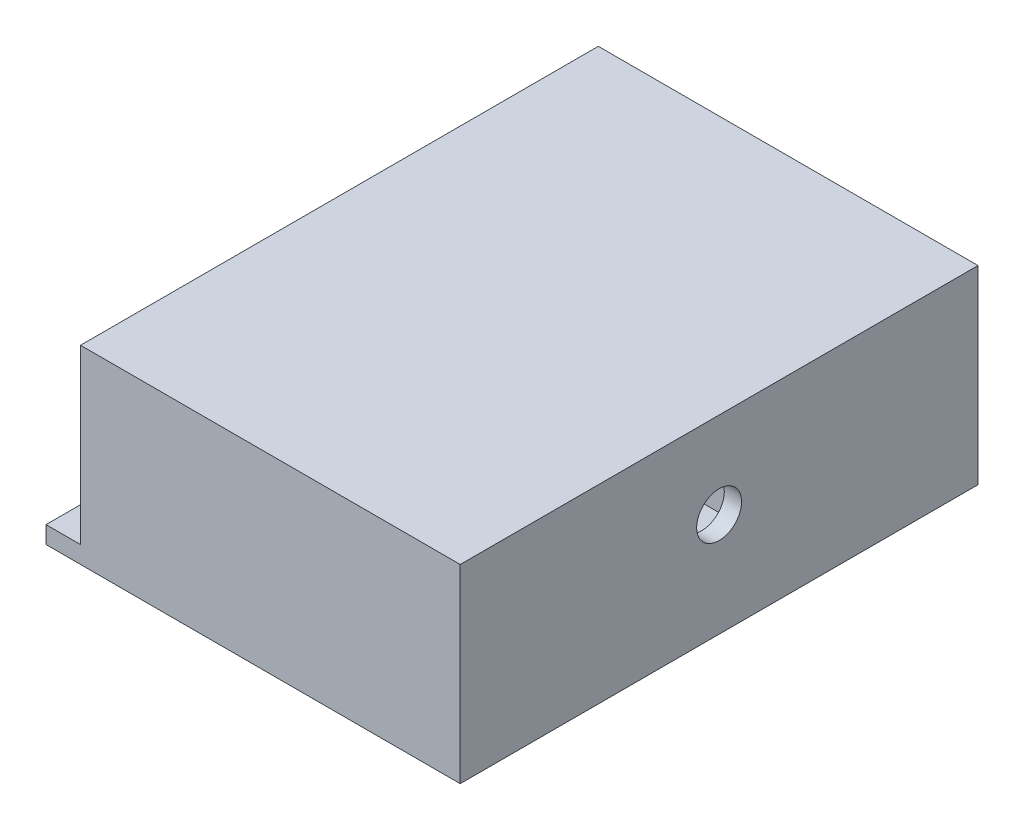
ISO-10303-21;
HEADER;
FILE_DESCRIPTION(('STEP AP214'),'2;1');
FILE_NAME('part.step','',(''),(''),'','','');
FILE_SCHEMA(('AUTOMOTIVE_DESIGN { 1 0 10303 214 1 1 1 1 }'));
ENDSEC;
DATA;
#1=APPLICATION_CONTEXT('core data for automotive mechanical design processes');
#2=APPLICATION_PROTOCOL_DEFINITION('international standard','automotive_design',2000,#1);
#3=PRODUCT_CONTEXT('',#1,'mechanical');
#4=PRODUCT('Part','Part','',(#3));
#5=PRODUCT_RELATED_PRODUCT_CATEGORY('part','',(#4));
#6=PRODUCT_DEFINITION_FORMATION('','',#4);
#7=PRODUCT_DEFINITION_CONTEXT('part definition',#1,'design');
#8=PRODUCT_DEFINITION('design','',#6,#7);
#9=PRODUCT_DEFINITION_SHAPE('','',#8);
#10=(LENGTH_UNIT() NAMED_UNIT(*) SI_UNIT(.MILLI.,.METRE.));
#11=(NAMED_UNIT(*) PLANE_ANGLE_UNIT() SI_UNIT($,.RADIAN.));
#12=(NAMED_UNIT(*) SI_UNIT($,.STERADIAN.) SOLID_ANGLE_UNIT());
#13=UNCERTAINTY_MEASURE_WITH_UNIT(LENGTH_MEASURE(1.E-05),#10,'distance_accuracy_value','');
#14=(GEOMETRIC_REPRESENTATION_CONTEXT(3) GLOBAL_UNCERTAINTY_ASSIGNED_CONTEXT((#13)) GLOBAL_UNIT_ASSIGNED_CONTEXT((#10,
#11,#12)) REPRESENTATION_CONTEXT('',''));
#15=CARTESIAN_POINT('',(0.,0.,0.));
#16=DIRECTION('',(0.,0.,1.));
#17=DIRECTION('',(1.,0.,0.));
#18=AXIS2_PLACEMENT_3D('',#15,#16,#17);
#19=CARTESIAN_POINT('',(115.,50.,-5.));
#20=DIRECTION('',(1.,0.,0.));
#21=DIRECTION('',(0.,0.,-1.));
#22=AXIS2_PLACEMENT_3D('',#19,#20,#21);
#23=PLANE('',#22);
#24=CARTESIAN_POINT('',(115.,30.,-75.));
#25=DIRECTION('',(1.,0.,0.));
#26=DIRECTION('',(0.,0.,-1.));
#27=AXIS2_PLACEMENT_3D('',#24,#25,#26);
#28=CIRCLE('',#27,6.5);
#29=CARTESIAN_POINT('',(115.,30.,-81.5));
#30=VERTEX_POINT('',#29);
#31=EDGE_CURVE('E325',#30,#30,#28,.T.);
#32=ORIENTED_EDGE('',*,*,#31,.T.);
#33=EDGE_LOOP('',(#32));
#34=FACE_BOUND('',#33,.T.);
#35=DIRECTION('',(0.,0.,1.));
#36=VECTOR('',#35,1.);
#37=CARTESIAN_POINT('',(115.,40.5,-36.5));
#38=LINE('',#37,#36);
#39=CARTESIAN_POINT('',(115.,40.5,-85.5));
#40=VERTEX_POINT('',#39);
#41=CARTESIAN_POINT('',(115.,40.5,-43.5));
#42=VERTEX_POINT('',#41);
#43=EDGE_CURVE('E207',#40,#42,#38,.T.);
#44=ORIENTED_EDGE('',*,*,#43,.F.);
#45=DIRECTION('',(0.,1.,0.));
#46=VECTOR('',#45,1.);
#47=CARTESIAN_POINT('',(115.,20.,-85.5));
#48=LINE('',#47,#46);
#49=CARTESIAN_POINT('',(115.,20.,-85.5));
#50=VERTEX_POINT('',#49);
#51=EDGE_CURVE('E235',#50,#40,#48,.T.);
#52=ORIENTED_EDGE('',*,*,#51,.F.);
#53=DIRECTION('',(0.,0.,-1.));
#54=VECTOR('',#53,1.);
#55=CARTESIAN_POINT('',(115.,20.,-92.5));
#56=LINE('',#55,#54);
#57=CARTESIAN_POINT('',(115.,20.,-43.5));
#58=VERTEX_POINT('',#57);
#59=EDGE_CURVE('E188',#58,#50,#56,.T.);
#60=ORIENTED_EDGE('',*,*,#59,.F.);
#61=DIRECTION('',(0.,-1.,0.));
#62=VECTOR('',#61,1.);
#63=CARTESIAN_POINT('',(115.,20.,-43.5));
#64=LINE('',#63,#62);
#65=EDGE_CURVE('E221',#42,#58,#64,.T.);
#66=ORIENTED_EDGE('',*,*,#65,.F.);
#67=EDGE_LOOP('',(#44,#52,#60,#66));
#68=FACE_BOUND('',#67,.T.);
#69=ADVANCED_FACE('F39',(#34,#68),#23,.F.);
#70=DIRECTION('',(0.,-1.,0.));
#71=VECTOR('',#70,1.);
#72=CARTESIAN_POINT('',(115.,5.,-92.5));
#73=LINE('',#72,#71);
#74=CARTESIAN_POINT('',(115.,45.5,-92.5));
#75=VERTEX_POINT('',#74);
#76=CARTESIAN_POINT('',(115.,5.,-92.5));
#77=VERTEX_POINT('',#76);
#78=EDGE_CURVE('E189',#75,#77,#73,.T.);
#79=ORIENTED_EDGE('',*,*,#78,.F.);
#80=DIRECTION('',(0.,0.,-1.));
#81=VECTOR('',#80,1.);
#82=CARTESIAN_POINT('',(115.,45.5,-36.5));
#83=LINE('',#82,#81);
#84=CARTESIAN_POINT('',(115.,45.5,-36.5));
#85=VERTEX_POINT('',#84);
#86=EDGE_CURVE('E195',#85,#75,#83,.T.);
#87=ORIENTED_EDGE('',*,*,#86,.F.);
#88=DIRECTION('',(0.,1.,0.));
#89=VECTOR('',#88,1.);
#90=CARTESIAN_POINT('',(115.,5.,-36.5));
#91=LINE('',#90,#89);
#92=CARTESIAN_POINT('',(115.,5.,-36.5));
#93=VERTEX_POINT('',#92);
#94=EDGE_CURVE('E176',#93,#85,#91,.T.);
#95=ORIENTED_EDGE('',*,*,#94,.F.);
#96=DIRECTION('',(0.,0.,1.));
#97=VECTOR('',#96,1.);
#98=CARTESIAN_POINT('',(115.,5.,-97.5));
#99=LINE('',#98,#97);
#100=CARTESIAN_POINT('',(115.,5.,-5.00000000000001));
#101=VERTEX_POINT('',#100);
#102=EDGE_CURVE('E288',#93,#101,#99,.T.);
#103=ORIENTED_EDGE('',*,*,#102,.T.);
#104=DIRECTION('',(0.,-1.,0.));
#105=VECTOR('',#104,1.);
#106=CARTESIAN_POINT('',(115.,50.,-5.));
#107=LINE('',#106,#105);
#108=CARTESIAN_POINT('',(115.,50.,-5.));
#109=VERTEX_POINT('',#108);
#110=EDGE_CURVE('E387',#109,#101,#107,.T.);
#111=ORIENTED_EDGE('',*,*,#110,.F.);
#112=DIRECTION('',(0.,0.,1.));
#113=VECTOR('',#112,1.);
#114=CARTESIAN_POINT('',(115.,50.,-5.));
#115=LINE('',#114,#113);
#116=CARTESIAN_POINT('',(115.,50.,-145.));
#117=VERTEX_POINT('',#116);
#118=EDGE_CURVE('E357',#117,#109,#115,.T.);
#119=ORIENTED_EDGE('',*,*,#118,.F.);
#120=DIRECTION('',(0.,-1.,0.));
#121=VECTOR('',#120,1.);
#122=CARTESIAN_POINT('',(115.,50.,-145.));
#123=LINE('',#122,#121);
#124=CARTESIAN_POINT('',(115.,5.,-145.));
#125=VERTEX_POINT('',#124);
#126=EDGE_CURVE('E391',#117,#125,#123,.T.);
#127=ORIENTED_EDGE('',*,*,#126,.T.);
#128=EDGE_CURVE('E289',#125,#77,#99,.T.);
#129=ORIENTED_EDGE('',*,*,#128,.T.);
#130=EDGE_LOOP('',(#79,#87,#95,#103,#111,#119,#127,#129));
#131=FACE_BOUND('',#130,.T.);
#132=ADVANCED_FACE('F202',(#131),#23,.F.);
#133=CARTESIAN_POINT('',(75.,20.,-92.5));
#134=DIRECTION('',(0.,-1.,0.));
#135=DIRECTION('',(0.,0.,-1.));
#136=AXIS2_PLACEMENT_3D('',#133,#134,#135);
#137=PLANE('',#136);
#138=DIRECTION('',(1.,0.,0.));
#139=VECTOR('',#138,1.);
#140=CARTESIAN_POINT('',(104.,20.,-43.5));
#141=LINE('',#140,#139);
#142=CARTESIAN_POINT('',(104.,20.,-43.5));
#143=VERTEX_POINT('',#142);
#144=EDGE_CURVE('E60',#143,#58,#141,.T.);
#145=ORIENTED_EDGE('',*,*,#144,.T.);
#146=ORIENTED_EDGE('',*,*,#59,.T.);
#147=DIRECTION('',(1.,0.,0.));
#148=VECTOR('',#147,1.);
#149=CARTESIAN_POINT('',(104.,20.,-85.5));
#150=LINE('',#149,#148);
#151=CARTESIAN_POINT('',(104.,20.,-85.5));
#152=VERTEX_POINT('',#151);
#153=EDGE_CURVE('E254',#152,#50,#150,.T.);
#154=ORIENTED_EDGE('',*,*,#153,.F.);
#155=DIRECTION('',(0.,0.,1.));
#156=VECTOR('',#155,1.);
#157=CARTESIAN_POINT('',(104.,20.,-92.5));
#158=LINE('',#157,#156);
#159=CARTESIAN_POINT('',(104.,20.,-92.5));
#160=VERTEX_POINT('',#159);
#161=EDGE_CURVE('E240',#160,#152,#158,.T.);
#162=ORIENTED_EDGE('',*,*,#161,.F.);
#163=DIRECTION('',(1.,0.,0.));
#164=VECTOR('',#163,1.);
#165=CARTESIAN_POINT('',(75.,20.,-92.5));
#166=LINE('',#165,#164);
#167=CARTESIAN_POINT('',(75.,20.,-92.5));
#168=VERTEX_POINT('',#167);
#169=EDGE_CURVE('E272',#168,#160,#166,.T.);
#170=ORIENTED_EDGE('',*,*,#169,.F.);
#171=DIRECTION('',(0.,0.,-1.));
#172=VECTOR('',#171,1.);
#173=CARTESIAN_POINT('',(75.,20.,-92.5));
#174=LINE('',#173,#172);
#175=CARTESIAN_POINT('',(75.,20.,-36.5));
#176=VERTEX_POINT('',#175);
#177=EDGE_CURVE('E269',#176,#168,#174,.T.);
#178=ORIENTED_EDGE('',*,*,#177,.F.);
#179=DIRECTION('',(1.,0.,0.));
#180=VECTOR('',#179,1.);
#181=CARTESIAN_POINT('',(75.,20.,-36.5));
#182=LINE('',#181,#180);
#183=CARTESIAN_POINT('',(104.,20.,-36.5));
#184=VERTEX_POINT('',#183);
#185=EDGE_CURVE('E280',#176,#184,#182,.T.);
#186=ORIENTED_EDGE('',*,*,#185,.T.);
#187=DIRECTION('',(0.,0.,1.));
#188=VECTOR('',#187,1.);
#189=CARTESIAN_POINT('',(104.,20.,-36.5));
#190=LINE('',#189,#188);
#191=EDGE_CURVE('E55',#143,#184,#190,.T.);
#192=ORIENTED_EDGE('',*,*,#191,.F.);
#193=EDGE_LOOP('',(#145,#146,#154,#162,#170,#178,#186,#192));
#194=FACE_BOUND('',#193,.T.);
#195=ADVANCED_FACE('F476',(#194),#137,.F.);
#196=CARTESIAN_POINT('',(0.,5.,0.));
#197=DIRECTION('',(0.,-1.,0.));
#198=DIRECTION('',(0.,0.,-1.));
#199=AXIS2_PLACEMENT_3D('',#196,#197,#198);
#200=PLANE('',#199);
#201=DIRECTION('',(1.,0.,0.));
#202=VECTOR('',#201,1.);
#203=CARTESIAN_POINT('',(75.,5.,-92.5));
#204=LINE('',#203,#202);
#205=CARTESIAN_POINT('',(75.,5.,-92.5));
#206=VERTEX_POINT('',#205);
#207=EDGE_CURVE('E285',#206,#77,#204,.T.);
#208=ORIENTED_EDGE('',*,*,#207,.T.);
#209=ORIENTED_EDGE('',*,*,#128,.F.);
#210=DIRECTION('',(1.,0.,0.));
#211=VECTOR('',#210,1.);
#212=CARTESIAN_POINT('',(115.,5.,-145.));
#213=LINE('',#212,#211);
#214=CARTESIAN_POINT('',(10.,5.,-145.));
#215=VERTEX_POINT('',#214);
#216=EDGE_CURVE('E370',#215,#125,#213,.T.);
#217=ORIENTED_EDGE('',*,*,#216,.F.);
#218=DIRECTION('',(0.,0.,1.));
#219=VECTOR('',#218,1.);
#220=CARTESIAN_POINT('',(10.,5.,-145.));
#221=LINE('',#220,#219);
#222=CARTESIAN_POINT('',(10.,5.,-150.));
#223=VERTEX_POINT('',#222);
#224=EDGE_CURVE('E349',#223,#215,#221,.T.);
#225=ORIENTED_EDGE('',*,*,#224,.F.);
#226=DIRECTION('',(-1.,0.,0.));
#227=VECTOR('',#226,1.);
#228=CARTESIAN_POINT('',(0.,5.,-150.));
#229=LINE('',#228,#227);
#230=CARTESIAN_POINT('',(0.,5.,-150.));
#231=VERTEX_POINT('',#230);
#232=EDGE_CURVE('E411',#223,#231,#229,.T.);
#233=ORIENTED_EDGE('',*,*,#232,.T.);
#234=DIRECTION('',(0.,0.,1.));
#235=VECTOR('',#234,1.);
#236=CARTESIAN_POINT('',(0.,5.,0.));
#237=LINE('',#236,#235);
#238=CARTESIAN_POINT('',(0.,5.,0.));
#239=VERTEX_POINT('',#238);
#240=EDGE_CURVE('E403',#231,#239,#237,.T.);
#241=ORIENTED_EDGE('',*,*,#240,.T.);
#242=DIRECTION('',(1.,0.,0.));
#243=VECTOR('',#242,1.);
#244=CARTESIAN_POINT('',(0.,5.,0.));
#245=LINE('',#244,#243);
#246=CARTESIAN_POINT('',(10.,5.,0.));
#247=VERTEX_POINT('',#246);
#248=EDGE_CURVE('E407',#239,#247,#245,.T.);
#249=ORIENTED_EDGE('',*,*,#248,.T.);
#250=DIRECTION('',(0.,0.,1.));
#251=VECTOR('',#250,1.);
#252=CARTESIAN_POINT('',(10.,5.,0.));
#253=LINE('',#252,#251);
#254=CARTESIAN_POINT('',(10.,5.,-5.));
#255=VERTEX_POINT('',#254);
#256=EDGE_CURVE('E358',#255,#247,#253,.T.);
#257=ORIENTED_EDGE('',*,*,#256,.F.);
#258=DIRECTION('',(-1.,0.,0.));
#259=VECTOR('',#258,1.);
#260=CARTESIAN_POINT('',(10.,5.,-5.));
#261=LINE('',#260,#259);
#262=EDGE_CURVE('E374',#101,#255,#261,.T.);
#263=ORIENTED_EDGE('',*,*,#262,.F.);
#264=ORIENTED_EDGE('',*,*,#102,.F.);
#265=DIRECTION('',(1.,0.,0.));
#266=VECTOR('',#265,1.);
#267=CARTESIAN_POINT('',(75.,5.,-36.5));
#268=LINE('',#267,#266);
#269=CARTESIAN_POINT('',(75.,5.,-36.5));
#270=VERTEX_POINT('',#269);
#271=EDGE_CURVE('E183',#270,#93,#268,.T.);
#272=ORIENTED_EDGE('',*,*,#271,.F.);
#273=DIRECTION('',(0.,0.,1.));
#274=VECTOR('',#273,1.);
#275=CARTESIAN_POINT('',(75.,5.,-92.5));
#276=LINE('',#275,#274);
#277=EDGE_CURVE('E262',#206,#270,#276,.T.);
#278=ORIENTED_EDGE('',*,*,#277,.F.);
#279=EDGE_LOOP('',(#208,#209,#217,#225,#233,#241,#249,#257,#263,#264,#272,#278));
#280=FACE_BOUND('',#279,.T.);
#281=ADVANCED_FACE('F453',(#280),#200,.F.);
#282=CARTESIAN_POINT('',(115.,50.,-145.));
#283=DIRECTION('',(0.,0.,-1.));
#284=DIRECTION('',(-1.,0.,0.));
#285=AXIS2_PLACEMENT_3D('',#282,#283,#284);
#286=PLANE('',#285);
#287=ORIENTED_EDGE('',*,*,#216,.T.);
#288=ORIENTED_EDGE('',*,*,#126,.F.);
#289=DIRECTION('',(1.,0.,0.));
#290=VECTOR('',#289,1.);
#291=CARTESIAN_POINT('',(115.,50.,-145.));
#292=LINE('',#291,#290);
#293=CARTESIAN_POINT('',(10.,50.,-145.));
#294=VERTEX_POINT('',#293);
#295=EDGE_CURVE('E353',#294,#117,#292,.T.);
#296=ORIENTED_EDGE('',*,*,#295,.F.);
#297=DIRECTION('',(0.,-1.,0.));
#298=VECTOR('',#297,1.);
#299=CARTESIAN_POINT('',(10.,50.,-145.));
#300=LINE('',#299,#298);
#301=EDGE_CURVE('E394',#294,#215,#300,.T.);
#302=ORIENTED_EDGE('',*,*,#301,.T.);
#303=EDGE_LOOP('',(#287,#288,#296,#302));
#304=FACE_BOUND('',#303,.T.);
#305=ADVANCED_FACE('F481',(#304),#286,.F.);
#306=CARTESIAN_POINT('',(10.,50.,-5.));
#307=DIRECTION('',(0.,0.,1.));
#308=DIRECTION('',(1.,0.,0.));
#309=AXIS2_PLACEMENT_3D('',#306,#307,#308);
#310=PLANE('',#309);
#311=ORIENTED_EDGE('',*,*,#110,.T.);
#312=ORIENTED_EDGE('',*,*,#262,.T.);
#313=DIRECTION('',(0.,-1.,0.));
#314=VECTOR('',#313,1.);
#315=CARTESIAN_POINT('',(10.,50.,-5.));
#316=LINE('',#315,#314);
#317=CARTESIAN_POINT('',(10.,50.,-5.));
#318=VERTEX_POINT('',#317);
#319=EDGE_CURVE('E383',#318,#255,#316,.T.);
#320=ORIENTED_EDGE('',*,*,#319,.F.);
#321=DIRECTION('',(-1.,0.,0.));
#322=VECTOR('',#321,1.);
#323=CARTESIAN_POINT('',(10.,50.,-5.));
#324=LINE('',#323,#322);
#325=EDGE_CURVE('E362',#109,#318,#324,.T.);
#326=ORIENTED_EDGE('',*,*,#325,.F.);
#327=EDGE_LOOP('',(#311,#312,#320,#326));
#328=FACE_BOUND('',#327,.T.);
#329=ADVANCED_FACE('F468',(#328),#310,.F.);
#330=CARTESIAN_POINT('',(0.,5.,0.));
#331=DIRECTION('',(1.,0.,0.));
#332=DIRECTION('',(0.,0.,-1.));
#333=AXIS2_PLACEMENT_3D('',#330,#331,#332);
#334=PLANE('',#333);
#335=DIRECTION('',(0.,0.,1.));
#336=VECTOR('',#335,1.);
#337=CARTESIAN_POINT('',(0.,0.,0.));
#338=LINE('',#337,#336);
#339=CARTESIAN_POINT('',(0.,0.,-150.));
#340=VERTEX_POINT('',#339);
#341=CARTESIAN_POINT('',(0.,0.,0.));
#342=VERTEX_POINT('',#341);
#343=EDGE_CURVE('E402',#340,#342,#338,.T.);
#344=ORIENTED_EDGE('',*,*,#343,.T.);
#345=DIRECTION('',(0.,-1.,0.));
#346=VECTOR('',#345,1.);
#347=CARTESIAN_POINT('',(0.,5.,0.));
#348=LINE('',#347,#346);
#349=EDGE_CURVE('E11',#239,#342,#348,.T.);
#350=ORIENTED_EDGE('',*,*,#349,.F.);
#351=ORIENTED_EDGE('',*,*,#240,.F.);
#352=DIRECTION('',(0.,-1.,0.));
#353=VECTOR('',#352,1.);
#354=CARTESIAN_POINT('',(0.,5.,-150.));
#355=LINE('',#354,#353);
#356=EDGE_CURVE('E414',#231,#340,#355,.T.);
#357=ORIENTED_EDGE('',*,*,#356,.T.);
#358=EDGE_LOOP('',(#344,#350,#351,#357));
#359=FACE_BOUND('',#358,.T.);
#360=ADVANCED_FACE('F41',(#359),#334,.F.);
#361=CARTESIAN_POINT('',(0.,5.,0.));
#362=DIRECTION('',(0.,0.,-1.));
#363=DIRECTION('',(-1.,0.,0.));
#364=AXIS2_PLACEMENT_3D('',#361,#362,#363);
#365=PLANE('',#364);
#366=DIRECTION('',(1.,0.,0.));
#367=VECTOR('',#366,1.);
#368=CARTESIAN_POINT('',(0.,0.,0.));
#369=LINE('',#368,#367);
#370=CARTESIAN_POINT('',(120.,0.,0.));
#371=VERTEX_POINT('',#370);
#372=EDGE_CURVE('E418',#342,#371,#369,.T.);
#373=ORIENTED_EDGE('',*,*,#372,.T.);
#374=DIRECTION('',(0.,-1.,0.));
#375=VECTOR('',#374,1.);
#376=CARTESIAN_POINT('',(120.,5.,0.));
#377=LINE('',#376,#375);
#378=CARTESIAN_POINT('',(120.,55.,0.));
#379=VERTEX_POINT('',#378);
#380=EDGE_CURVE('E48',#379,#371,#377,.T.);
#381=ORIENTED_EDGE('',*,*,#380,.F.);
#382=DIRECTION('',(1.,0.,0.));
#383=VECTOR('',#382,1.);
#384=CARTESIAN_POINT('',(10.,55.,0.));
#385=LINE('',#384,#383);
#386=CARTESIAN_POINT('',(10.,55.,0.));
#387=VERTEX_POINT('',#386);
#388=EDGE_CURVE('E337',#387,#379,#385,.T.);
#389=ORIENTED_EDGE('',*,*,#388,.F.);
#390=DIRECTION('',(0.,-1.,0.));
#391=VECTOR('',#390,1.);
#392=CARTESIAN_POINT('',(10.,50.,0.));
#393=LINE('',#392,#391);
#394=EDGE_CURVE('E366',#387,#247,#393,.T.);
#395=ORIENTED_EDGE('',*,*,#394,.T.);
#396=ORIENTED_EDGE('',*,*,#248,.F.);
#397=ORIENTED_EDGE('',*,*,#349,.T.);
#398=EDGE_LOOP('',(#373,#381,#389,#395,#396,#397));
#399=FACE_BOUND('',#398,.T.);
#400=ADVANCED_FACE('F460',(#399),#365,.F.);
#401=CARTESIAN_POINT('',(120.,5.,0.));
#402=DIRECTION('',(-1.,0.,0.));
#403=DIRECTION('',(0.,0.,1.));
#404=AXIS2_PLACEMENT_3D('',#401,#402,#403);
#405=PLANE('',#404);
#406=CARTESIAN_POINT('',(120.,30.,-75.));
#407=DIRECTION('',(1.,0.,0.));
#408=DIRECTION('',(0.,0.,-1.));
#409=AXIS2_PLACEMENT_3D('',#406,#407,#408);
#410=CIRCLE('',#409,6.5);
#411=CARTESIAN_POINT('',(120.,30.,-81.5));
#412=VERTEX_POINT('',#411);
#413=EDGE_CURVE('E321',#412,#412,#410,.T.);
#414=ORIENTED_EDGE('',*,*,#413,.F.);
#415=EDGE_LOOP('',(#414));
#416=FACE_BOUND('',#415,.T.);
#417=DIRECTION('',(0.,0.,-1.));
#418=VECTOR('',#417,1.);
#419=CARTESIAN_POINT('',(120.,0.,0.));
#420=LINE('',#419,#418);
#421=CARTESIAN_POINT('',(120.,0.,-150.));
#422=VERTEX_POINT('',#421);
#423=EDGE_CURVE('E421',#371,#422,#420,.T.);
#424=ORIENTED_EDGE('',*,*,#423,.T.);
#425=DIRECTION('',(0.,-1.,0.));
#426=VECTOR('',#425,1.);
#427=CARTESIAN_POINT('',(120.,5.,-150.));
#428=LINE('',#427,#426);
#429=CARTESIAN_POINT('',(120.,55.,-150.));
#430=VERTEX_POINT('',#429);
#431=EDGE_CURVE('E429',#430,#422,#428,.T.);
#432=ORIENTED_EDGE('',*,*,#431,.F.);
#433=DIRECTION('',(0.,0.,-1.));
#434=VECTOR('',#433,1.);
#435=CARTESIAN_POINT('',(120.,55.,-150.));
#436=LINE('',#435,#434);
#437=EDGE_CURVE('E341',#379,#430,#436,.T.);
#438=ORIENTED_EDGE('',*,*,#437,.F.);
#439=ORIENTED_EDGE('',*,*,#380,.T.);
#440=EDGE_LOOP('',(#424,#432,#438,#439));
#441=FACE_BOUND('',#440,.T.);
#442=ADVANCED_FACE('F437',(#416,#441),#405,.F.);
#443=CARTESIAN_POINT('',(0.,5.,-150.));
#444=DIRECTION('',(0.,0.,1.));
#445=DIRECTION('',(1.,0.,0.));
#446=AXIS2_PLACEMENT_3D('',#443,#444,#445);
#447=PLANE('',#446);
#448=DIRECTION('',(-1.,0.,0.));
#449=VECTOR('',#448,1.);
#450=CARTESIAN_POINT('',(0.,0.,-150.));
#451=LINE('',#450,#449);
#452=EDGE_CURVE('E408',#422,#340,#451,.T.);
#453=ORIENTED_EDGE('',*,*,#452,.T.);
#454=ORIENTED_EDGE('',*,*,#356,.F.);
#455=ORIENTED_EDGE('',*,*,#232,.F.);
#456=DIRECTION('',(0.,-1.,0.));
#457=VECTOR('',#456,1.);
#458=CARTESIAN_POINT('',(10.,50.,-150.));
#459=LINE('',#458,#457);
#460=CARTESIAN_POINT('',(10.,55.,-150.));
#461=VERTEX_POINT('',#460);
#462=EDGE_CURVE('E398',#461,#223,#459,.T.);
#463=ORIENTED_EDGE('',*,*,#462,.F.);
#464=DIRECTION('',(-1.,0.,0.));
#465=VECTOR('',#464,1.);
#466=CARTESIAN_POINT('',(10.,55.,-150.));
#467=LINE('',#466,#465);
#468=EDGE_CURVE('E345',#430,#461,#467,.T.);
#469=ORIENTED_EDGE('',*,*,#468,.F.);
#470=ORIENTED_EDGE('',*,*,#431,.T.);
#471=EDGE_LOOP('',(#453,#454,#455,#463,#469,#470));
#472=FACE_BOUND('',#471,.T.);
#473=ADVANCED_FACE('F446',(#472),#447,.F.);
#474=CARTESIAN_POINT('',(0.,0.,0.));
#475=DIRECTION('',(0.,-1.,0.));
#476=DIRECTION('',(0.,0.,-1.));
#477=AXIS2_PLACEMENT_3D('',#474,#475,#476);
#478=PLANE('',#477);
#479=ORIENTED_EDGE('',*,*,#343,.F.);
#480=ORIENTED_EDGE('',*,*,#452,.F.);
#481=ORIENTED_EDGE('',*,*,#423,.F.);
#482=ORIENTED_EDGE('',*,*,#372,.F.);
#483=EDGE_LOOP('',(#479,#480,#481,#482));
#484=FACE_BOUND('',#483,.T.);
#485=ADVANCED_FACE('F443',(#484),#478,.T.);
#486=CARTESIAN_POINT('',(10.,50.,-145.));
#487=DIRECTION('',(1.,0.,0.));
#488=DIRECTION('',(0.,0.,-1.));
#489=AXIS2_PLACEMENT_3D('',#486,#487,#488);
#490=PLANE('',#489);
#491=CARTESIAN_POINT('',(10.,52.5,-147.5));
#492=DIRECTION('',(-1.,0.,0.));
#493=DIRECTION('',(0.,0.,1.));
#494=AXIS2_PLACEMENT_3D('',#491,#492,#493);
#495=CIRCLE('',#494,1.5);
#496=CARTESIAN_POINT('',(10.,52.5,-146.));
#497=VERTEX_POINT('',#496);
#498=EDGE_CURVE('E306',#497,#497,#495,.T.);
#499=ORIENTED_EDGE('',*,*,#498,.F.);
#500=EDGE_LOOP('',(#499));
#501=FACE_BOUND('',#500,.T.);
#502=CARTESIAN_POINT('',(10.,10.,-2.50000000000001));
#503=DIRECTION('',(-1.,0.,0.));
#504=DIRECTION('',(0.,0.,1.));
#505=AXIS2_PLACEMENT_3D('',#502,#503,#504);
#506=CIRCLE('',#505,1.5);
#507=CARTESIAN_POINT('',(10.,10.,-1.00000000000001));
#508=VERTEX_POINT('',#507);
#509=EDGE_CURVE('E297',#508,#508,#506,.T.);
#510=ORIENTED_EDGE('',*,*,#509,.F.);
#511=EDGE_LOOP('',(#510));
#512=FACE_BOUND('',#511,.T.);
#513=CARTESIAN_POINT('',(10.,52.5,-2.50000000000001));
#514=DIRECTION('',(-1.,0.,0.));
#515=DIRECTION('',(0.,0.,1.));
#516=AXIS2_PLACEMENT_3D('',#513,#514,#515);
#517=CIRCLE('',#516,1.5);
#518=CARTESIAN_POINT('',(10.,52.5,-1.));
#519=VERTEX_POINT('',#518);
#520=EDGE_CURVE('E292',#519,#519,#517,.T.);
#521=ORIENTED_EDGE('',*,*,#520,.F.);
#522=EDGE_LOOP('',(#521));
#523=FACE_BOUND('',#522,.T.);
#524=CARTESIAN_POINT('',(10.,10.,-147.5));
#525=DIRECTION('',(-1.,0.,0.));
#526=DIRECTION('',(0.,0.,1.));
#527=AXIS2_PLACEMENT_3D('',#524,#525,#526);
#528=CIRCLE('',#527,1.5);
#529=CARTESIAN_POINT('',(10.,10.,-146.));
#530=VERTEX_POINT('',#529);
#531=EDGE_CURVE('E305',#530,#530,#528,.T.);
#532=ORIENTED_EDGE('',*,*,#531,.F.);
#533=EDGE_LOOP('',(#532));
#534=FACE_BOUND('',#533,.T.);
#535=ORIENTED_EDGE('',*,*,#224,.T.);
#536=ORIENTED_EDGE('',*,*,#301,.F.);
#537=DIRECTION('',(0.,0.,1.));
#538=VECTOR('',#537,1.);
#539=CARTESIAN_POINT('',(10.,50.,-150.));
#540=LINE('',#539,#538);
#541=EDGE_CURVE('E329',#294,#318,#540,.T.);
#542=ORIENTED_EDGE('',*,*,#541,.T.);
#543=ORIENTED_EDGE('',*,*,#319,.T.);
#544=ORIENTED_EDGE('',*,*,#256,.T.);
#545=ORIENTED_EDGE('',*,*,#394,.F.);
#546=DIRECTION('',(0.,0.,1.));
#547=VECTOR('',#546,1.);
#548=CARTESIAN_POINT('',(10.,55.,-150.));
#549=LINE('',#548,#547);
#550=EDGE_CURVE('E333',#461,#387,#549,.T.);
#551=ORIENTED_EDGE('',*,*,#550,.F.);
#552=ORIENTED_EDGE('',*,*,#462,.T.);
#553=EDGE_LOOP('',(#535,#536,#542,#543,#544,#545,#551,#552));
#554=FACE_BOUND('',#553,.T.);
#555=ADVANCED_FACE('F457',(#501,#512,#523,#534,#554),#490,.F.);
#556=CARTESIAN_POINT('',(0.,50.,0.));
#557=DIRECTION('',(0.,1.,0.));
#558=DIRECTION('',(0.,0.,1.));
#559=AXIS2_PLACEMENT_3D('',#556,#557,#558);
#560=PLANE('',#559);
#561=ORIENTED_EDGE('',*,*,#541,.F.);
#562=ORIENTED_EDGE('',*,*,#295,.T.);
#563=ORIENTED_EDGE('',*,*,#118,.T.);
#564=ORIENTED_EDGE('',*,*,#325,.T.);
#565=EDGE_LOOP('',(#561,#562,#563,#564));
#566=FACE_BOUND('',#565,.T.);
#567=ADVANCED_FACE('F487',(#566),#560,.F.);
#568=CARTESIAN_POINT('',(0.,55.,0.));
#569=DIRECTION('',(0.,1.,0.));
#570=DIRECTION('',(0.,0.,1.));
#571=AXIS2_PLACEMENT_3D('',#568,#569,#570);
#572=PLANE('',#571);
#573=ORIENTED_EDGE('',*,*,#550,.T.);
#574=ORIENTED_EDGE('',*,*,#388,.T.);
#575=ORIENTED_EDGE('',*,*,#437,.T.);
#576=ORIENTED_EDGE('',*,*,#468,.T.);
#577=EDGE_LOOP('',(#573,#574,#575,#576));
#578=FACE_BOUND('',#577,.T.);
#579=ADVANCED_FACE('F459',(#578),#572,.T.);
#580=CARTESIAN_POINT('',(115.,30.,-75.));
#581=DIRECTION('',(1.,0.,0.));
#582=DIRECTION('',(0.,0.,-1.));
#583=AXIS2_PLACEMENT_3D('',#580,#581,#582);
#584=CYLINDRICAL_SURFACE('',#583,6.5);
#585=ORIENTED_EDGE('',*,*,#31,.F.);
#586=EDGE_LOOP('',(#585));
#587=FACE_BOUND('',#586,.T.);
#588=ORIENTED_EDGE('',*,*,#413,.T.);
#589=EDGE_LOOP('',(#588));
#590=FACE_BOUND('',#589,.T.);
#591=ADVANCED_FACE('F521',(#587,#590),#584,.F.);
#592=CARTESIAN_POINT('',(20.0000000000001,10.,-147.5));
#593=DIRECTION('',(-1.,0.,0.));
#594=DIRECTION('',(0.,0.,1.));
#595=AXIS2_PLACEMENT_3D('',#592,#593,#594);
#596=CYLINDRICAL_SURFACE('',#595,1.5);
#597=CARTESIAN_POINT('',(20.0000000000001,10.,-147.5));
#598=DIRECTION('',(-1.,0.,0.));
#599=DIRECTION('',(0.,0.,1.));
#600=AXIS2_PLACEMENT_3D('',#597,#598,#599);
#601=CIRCLE('',#600,1.5);
#602=CARTESIAN_POINT('',(20.0000000000001,10.,-146.));
#603=VERTEX_POINT('',#602);
#604=EDGE_CURVE('E317',#603,#603,#601,.T.);
#605=ORIENTED_EDGE('',*,*,#604,.F.);
#606=EDGE_LOOP('',(#605));
#607=FACE_BOUND('',#606,.T.);
#608=ORIENTED_EDGE('',*,*,#531,.T.);
#609=EDGE_LOOP('',(#608));
#610=FACE_BOUND('',#609,.T.);
#611=ADVANCED_FACE('F527',(#607,#610),#596,.F.);
#612=CARTESIAN_POINT('',(20.0000000000001,10.,-147.5));
#613=DIRECTION('',(-1.,0.,0.));
#614=DIRECTION('',(0.,0.,1.));
#615=AXIS2_PLACEMENT_3D('',#612,#613,#614);
#616=PLANE('',#615);
#617=ORIENTED_EDGE('',*,*,#604,.T.);
#618=EDGE_LOOP('',(#617));
#619=FACE_BOUND('',#618,.T.);
#620=ADVANCED_FACE('F534',(#619),#616,.T.);
#621=CARTESIAN_POINT('',(20.0000000000001,52.5,-2.50000000000001));
#622=DIRECTION('',(-1.,0.,0.));
#623=DIRECTION('',(0.,0.,1.));
#624=AXIS2_PLACEMENT_3D('',#621,#622,#623);
#625=CYLINDRICAL_SURFACE('',#624,1.5);
#626=CARTESIAN_POINT('',(20.0000000000001,52.5,-2.50000000000001));
#627=DIRECTION('',(-1.,0.,0.));
#628=DIRECTION('',(0.,0.,1.));
#629=AXIS2_PLACEMENT_3D('',#626,#627,#628);
#630=CIRCLE('',#629,1.5);
#631=CARTESIAN_POINT('',(20.0000000000001,52.5,-1.));
#632=VERTEX_POINT('',#631);
#633=EDGE_CURVE('E293',#632,#632,#630,.T.);
#634=ORIENTED_EDGE('',*,*,#633,.F.);
#635=EDGE_LOOP('',(#634));
#636=FACE_BOUND('',#635,.T.);
#637=ORIENTED_EDGE('',*,*,#520,.T.);
#638=EDGE_LOOP('',(#637));
#639=FACE_BOUND('',#638,.T.);
#640=ADVANCED_FACE('F542',(#636,#639),#625,.F.);
#641=CARTESIAN_POINT('',(20.0000000000001,52.5,-2.50000000000001));
#642=DIRECTION('',(-1.,0.,0.));
#643=DIRECTION('',(0.,0.,1.));
#644=AXIS2_PLACEMENT_3D('',#641,#642,#643);
#645=PLANE('',#644);
#646=ORIENTED_EDGE('',*,*,#633,.T.);
#647=EDGE_LOOP('',(#646));
#648=FACE_BOUND('',#647,.T.);
#649=ADVANCED_FACE('F550',(#648),#645,.T.);
#650=CARTESIAN_POINT('',(20.0000000000001,10.,-2.50000000000001));
#651=DIRECTION('',(-1.,0.,0.));
#652=DIRECTION('',(0.,0.,1.));
#653=AXIS2_PLACEMENT_3D('',#650,#651,#652);
#654=CYLINDRICAL_SURFACE('',#653,1.5);
#655=CARTESIAN_POINT('',(20.0000000000001,10.,-2.50000000000001));
#656=DIRECTION('',(-1.,0.,0.));
#657=DIRECTION('',(0.,0.,1.));
#658=AXIS2_PLACEMENT_3D('',#655,#656,#657);
#659=CIRCLE('',#658,1.5);
#660=CARTESIAN_POINT('',(20.0000000000001,10.,-1.00000000000001));
#661=VERTEX_POINT('',#660);
#662=EDGE_CURVE('E310',#661,#661,#659,.T.);
#663=ORIENTED_EDGE('',*,*,#662,.F.);
#664=EDGE_LOOP('',(#663));
#665=FACE_BOUND('',#664,.T.);
#666=ORIENTED_EDGE('',*,*,#509,.T.);
#667=EDGE_LOOP('',(#666));
#668=FACE_BOUND('',#667,.T.);
#669=ADVANCED_FACE('F558',(#665,#668),#654,.F.);
#670=CARTESIAN_POINT('',(20.0000000000001,10.,-2.50000000000001));
#671=DIRECTION('',(-1.,0.,0.));
#672=DIRECTION('',(0.,0.,1.));
#673=AXIS2_PLACEMENT_3D('',#670,#671,#672);
#674=PLANE('',#673);
#675=ORIENTED_EDGE('',*,*,#662,.T.);
#676=EDGE_LOOP('',(#675));
#677=FACE_BOUND('',#676,.T.);
#678=ADVANCED_FACE('F566',(#677),#674,.T.);
#679=CARTESIAN_POINT('',(20.0000000000001,52.5,-147.5));
#680=DIRECTION('',(-1.,0.,0.));
#681=DIRECTION('',(0.,0.,1.));
#682=AXIS2_PLACEMENT_3D('',#679,#680,#681);
#683=CYLINDRICAL_SURFACE('',#682,1.5);
#684=CARTESIAN_POINT('',(20.0000000000001,52.5,-147.5));
#685=DIRECTION('',(-1.,0.,0.));
#686=DIRECTION('',(0.,0.,1.));
#687=AXIS2_PLACEMENT_3D('',#684,#685,#686);
#688=CIRCLE('',#687,1.5);
#689=CARTESIAN_POINT('',(20.0000000000001,52.5,-146.));
#690=VERTEX_POINT('',#689);
#691=EDGE_CURVE('E301',#690,#690,#688,.T.);
#692=ORIENTED_EDGE('',*,*,#691,.F.);
#693=EDGE_LOOP('',(#692));
#694=FACE_BOUND('',#693,.T.);
#695=ORIENTED_EDGE('',*,*,#498,.T.);
#696=EDGE_LOOP('',(#695));
#697=FACE_BOUND('',#696,.T.);
#698=ADVANCED_FACE('F574',(#694,#697),#683,.F.);
#699=CARTESIAN_POINT('',(20.0000000000001,52.5,-147.5));
#700=DIRECTION('',(-1.,0.,0.));
#701=DIRECTION('',(0.,0.,1.));
#702=AXIS2_PLACEMENT_3D('',#699,#700,#701);
#703=PLANE('',#702);
#704=ORIENTED_EDGE('',*,*,#691,.T.);
#705=EDGE_LOOP('',(#704));
#706=FACE_BOUND('',#705,.T.);
#707=ADVANCED_FACE('F582',(#706),#703,.T.);
#708=CARTESIAN_POINT('',(75.,5.,-92.5));
#709=DIRECTION('',(0.,0.,1.));
#710=DIRECTION('',(1.,0.,0.));
#711=AXIS2_PLACEMENT_3D('',#708,#709,#710);
#712=PLANE('',#711);
#713=ORIENTED_EDGE('',*,*,#78,.T.);
#714=ORIENTED_EDGE('',*,*,#207,.F.);
#715=DIRECTION('',(0.,-1.,0.));
#716=VECTOR('',#715,1.);
#717=CARTESIAN_POINT('',(75.,5.,-92.5));
#718=LINE('',#717,#716);
#719=EDGE_CURVE('E258',#168,#206,#718,.T.);
#720=ORIENTED_EDGE('',*,*,#719,.F.);
#721=ORIENTED_EDGE('',*,*,#169,.T.);
#722=DIRECTION('',(0.,-1.,0.));
#723=VECTOR('',#722,1.);
#724=CARTESIAN_POINT('',(104.,20.,-92.5));
#725=LINE('',#724,#723);
#726=CARTESIAN_POINT('',(104.,45.5,-92.5));
#727=VERTEX_POINT('',#726);
#728=EDGE_CURVE('E236',#727,#160,#725,.T.);
#729=ORIENTED_EDGE('',*,*,#728,.F.);
#730=DIRECTION('',(1.,0.,0.));
#731=VECTOR('',#730,1.);
#732=CARTESIAN_POINT('',(47.7772288125176,45.5,-92.5));
#733=LINE('',#732,#731);
#734=EDGE_CURVE('E200',#727,#75,#733,.T.);
#735=ORIENTED_EDGE('',*,*,#734,.T.);
#736=EDGE_LOOP('',(#713,#714,#720,#721,#729,#735));
#737=FACE_BOUND('',#736,.T.);
#738=ADVANCED_FACE('F590',(#737),#712,.F.);
#739=CARTESIAN_POINT('',(75.,5.,-36.5));
#740=DIRECTION('',(0.,0.,-1.));
#741=DIRECTION('',(-1.,0.,0.));
#742=AXIS2_PLACEMENT_3D('',#739,#740,#741);
#743=PLANE('',#742);
#744=ORIENTED_EDGE('',*,*,#94,.T.);
#745=DIRECTION('',(1.,0.,0.));
#746=VECTOR('',#745,1.);
#747=CARTESIAN_POINT('',(47.7772288125176,45.5,-36.5));
#748=LINE('',#747,#746);
#749=CARTESIAN_POINT('',(104.,45.5,-36.5));
#750=VERTEX_POINT('',#749);
#751=EDGE_CURVE('E180',#750,#85,#748,.T.);
#752=ORIENTED_EDGE('',*,*,#751,.F.);
#753=DIRECTION('',(0.,1.,0.));
#754=VECTOR('',#753,1.);
#755=CARTESIAN_POINT('',(104.,20.,-36.5));
#756=LINE('',#755,#754);
#757=EDGE_CURVE('E217',#184,#750,#756,.T.);
#758=ORIENTED_EDGE('',*,*,#757,.F.);
#759=ORIENTED_EDGE('',*,*,#185,.F.);
#760=DIRECTION('',(0.,1.,0.));
#761=VECTOR('',#760,1.);
#762=CARTESIAN_POINT('',(75.,5.,-36.5));
#763=LINE('',#762,#761);
#764=EDGE_CURVE('E266',#270,#176,#763,.T.);
#765=ORIENTED_EDGE('',*,*,#764,.F.);
#766=ORIENTED_EDGE('',*,*,#271,.T.);
#767=EDGE_LOOP('',(#744,#752,#758,#759,#765,#766));
#768=FACE_BOUND('',#767,.T.);
#769=ADVANCED_FACE('F178',(#768),#743,.F.);
#770=CARTESIAN_POINT('',(75.,0.,0.));
#771=DIRECTION('',(1.,0.,0.));
#772=DIRECTION('',(0.,0.,-1.));
#773=AXIS2_PLACEMENT_3D('',#770,#771,#772);
#774=PLANE('',#773);
#775=ORIENTED_EDGE('',*,*,#719,.T.);
#776=ORIENTED_EDGE('',*,*,#277,.T.);
#777=ORIENTED_EDGE('',*,*,#764,.T.);
#778=ORIENTED_EDGE('',*,*,#177,.T.);
#779=EDGE_LOOP('',(#775,#776,#777,#778));
#780=FACE_BOUND('',#779,.T.);
#781=ADVANCED_FACE('F596',(#780),#774,.F.);
#782=CARTESIAN_POINT('',(104.,20.,-85.5));
#783=DIRECTION('',(0.,0.,-1.));
#784=DIRECTION('',(-1.,0.,0.));
#785=AXIS2_PLACEMENT_3D('',#782,#783,#784);
#786=PLANE('',#785);
#787=ORIENTED_EDGE('',*,*,#51,.T.);
#788=DIRECTION('',(1.,0.,0.));
#789=VECTOR('',#788,1.);
#790=CARTESIAN_POINT('',(104.,40.5,-85.5));
#791=LINE('',#790,#789);
#792=CARTESIAN_POINT('',(104.,40.5,-85.5));
#793=VERTEX_POINT('',#792);
#794=EDGE_CURVE('E248',#793,#40,#791,.T.);
#795=ORIENTED_EDGE('',*,*,#794,.F.);
#796=DIRECTION('',(0.,1.,0.));
#797=VECTOR('',#796,1.);
#798=CARTESIAN_POINT('',(104.,20.,-85.5));
#799=LINE('',#798,#797);
#800=EDGE_CURVE('E244',#152,#793,#799,.T.);
#801=ORIENTED_EDGE('',*,*,#800,.F.);
#802=ORIENTED_EDGE('',*,*,#153,.T.);
#803=EDGE_LOOP('',(#787,#795,#801,#802));
#804=FACE_BOUND('',#803,.T.);
#805=ADVANCED_FACE('F600',(#804),#786,.F.);
#806=CARTESIAN_POINT('',(104.,0.,0.));
#807=DIRECTION('',(1.,0.,0.));
#808=DIRECTION('',(0.,0.,-1.));
#809=AXIS2_PLACEMENT_3D('',#806,#807,#808);
#810=PLANE('',#809);
#811=ORIENTED_EDGE('',*,*,#728,.T.);
#812=ORIENTED_EDGE('',*,*,#161,.T.);
#813=ORIENTED_EDGE('',*,*,#800,.T.);
#814=DIRECTION('',(0.,0.,-1.));
#815=VECTOR('',#814,1.);
#816=CARTESIAN_POINT('',(104.,40.5,-36.5));
#817=LINE('',#816,#815);
#818=CARTESIAN_POINT('',(104.,40.5,-43.5));
#819=VERTEX_POINT('',#818);
#820=EDGE_CURVE('E199',#819,#793,#817,.T.);
#821=ORIENTED_EDGE('',*,*,#820,.F.);
#822=DIRECTION('',(0.,-1.,0.));
#823=VECTOR('',#822,1.);
#824=CARTESIAN_POINT('',(104.,20.,-43.5));
#825=LINE('',#824,#823);
#826=EDGE_CURVE('E220',#819,#143,#825,.T.);
#827=ORIENTED_EDGE('',*,*,#826,.T.);
#828=ORIENTED_EDGE('',*,*,#191,.T.);
#829=ORIENTED_EDGE('',*,*,#757,.T.);
#830=DIRECTION('',(0.,0.,1.));
#831=VECTOR('',#830,1.);
#832=CARTESIAN_POINT('',(104.,45.5,-36.5));
#833=LINE('',#832,#831);
#834=EDGE_CURVE('E197',#727,#750,#833,.T.);
#835=ORIENTED_EDGE('',*,*,#834,.F.);
#836=EDGE_LOOP('',(#811,#812,#813,#821,#827,#828,#829,#835));
#837=FACE_BOUND('',#836,.T.);
#838=ADVANCED_FACE('F644',(#837),#810,.F.);
#839=CARTESIAN_POINT('',(104.,20.,-43.5));
#840=DIRECTION('',(0.,0.,1.));
#841=DIRECTION('',(1.,0.,0.));
#842=AXIS2_PLACEMENT_3D('',#839,#840,#841);
#843=PLANE('',#842);
#844=ORIENTED_EDGE('',*,*,#65,.T.);
#845=ORIENTED_EDGE('',*,*,#144,.F.);
#846=ORIENTED_EDGE('',*,*,#826,.F.);
#847=DIRECTION('',(1.,0.,0.));
#848=VECTOR('',#847,1.);
#849=CARTESIAN_POINT('',(104.,40.5,-43.5));
#850=LINE('',#849,#848);
#851=EDGE_CURVE('E231',#819,#42,#850,.T.);
#852=ORIENTED_EDGE('',*,*,#851,.T.);
#853=EDGE_LOOP('',(#844,#845,#846,#852));
#854=FACE_BOUND('',#853,.T.);
#855=ADVANCED_FACE('F652',(#854),#843,.F.);
#856=CARTESIAN_POINT('',(47.7772288125176,40.5,-36.5));
#857=DIRECTION('',(0.,1.,0.));
#858=DIRECTION('',(0.,0.,1.));
#859=AXIS2_PLACEMENT_3D('',#856,#857,#858);
#860=PLANE('',#859);
#861=ORIENTED_EDGE('',*,*,#820,.T.);
#862=ORIENTED_EDGE('',*,*,#794,.T.);
#863=ORIENTED_EDGE('',*,*,#43,.T.);
#864=ORIENTED_EDGE('',*,*,#851,.F.);
#865=EDGE_LOOP('',(#861,#862,#863,#864));
#866=FACE_BOUND('',#865,.T.);
#867=ADVANCED_FACE('F660',(#866),#860,.F.);
#868=CARTESIAN_POINT('',(47.7772288125176,45.5,-36.5));
#869=DIRECTION('',(0.,-1.,0.));
#870=DIRECTION('',(0.,0.,-1.));
#871=AXIS2_PLACEMENT_3D('',#868,#869,#870);
#872=PLANE('',#871);
#873=ORIENTED_EDGE('',*,*,#734,.F.);
#874=ORIENTED_EDGE('',*,*,#834,.T.);
#875=ORIENTED_EDGE('',*,*,#751,.T.);
#876=ORIENTED_EDGE('',*,*,#86,.T.);
#877=EDGE_LOOP('',(#873,#874,#875,#876));
#878=FACE_BOUND('',#877,.T.);
#879=ADVANCED_FACE('F194',(#878),#872,.F.);
#880=CLOSED_SHELL('',(#69,#132,#195,#281,#305,#329,#360,#400,#442,#473,#485,#555,#567,#579,#591,
#611,#620,#640,#649,#669,#678,#698,#707,#738,#769,#781,#805,#838,#855,#867,#879));
#881=MANIFOLD_SOLID_BREP('B2',#880);
#882=ADVANCED_BREP_SHAPE_REPRESENTATION('',(#18,#881),#14);
#883=SHAPE_DEFINITION_REPRESENTATION(#9,#882);
ENDSEC;
END-ISO-10303-21;
